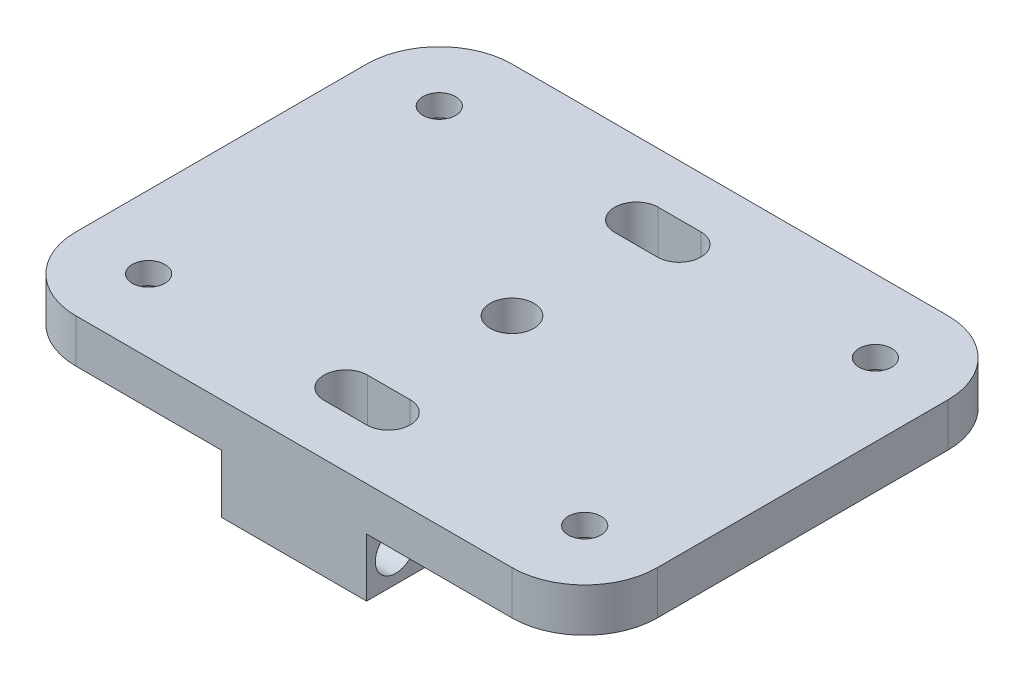
ISO-10303-21;
HEADER;
FILE_DESCRIPTION(('STEP AP214'),'2;1');
FILE_NAME('part.step','',(''),(''),'','','');
FILE_SCHEMA(('AUTOMOTIVE_DESIGN { 1 0 10303 214 1 1 1 1 }'));
ENDSEC;
DATA;
#1=APPLICATION_CONTEXT('core data for automotive mechanical design processes');
#2=APPLICATION_PROTOCOL_DEFINITION('international standard','automotive_design',2000,#1);
#3=PRODUCT_CONTEXT('',#1,'mechanical');
#4=PRODUCT('Part','Part','',(#3));
#5=PRODUCT_RELATED_PRODUCT_CATEGORY('part','',(#4));
#6=PRODUCT_DEFINITION_FORMATION('','',#4);
#7=PRODUCT_DEFINITION_CONTEXT('part definition',#1,'design');
#8=PRODUCT_DEFINITION('design','',#6,#7);
#9=PRODUCT_DEFINITION_SHAPE('','',#8);
#10=(LENGTH_UNIT() NAMED_UNIT(*) SI_UNIT(.MILLI.,.METRE.));
#11=(NAMED_UNIT(*) PLANE_ANGLE_UNIT() SI_UNIT($,.RADIAN.));
#12=(NAMED_UNIT(*) SI_UNIT($,.STERADIAN.) SOLID_ANGLE_UNIT());
#13=UNCERTAINTY_MEASURE_WITH_UNIT(LENGTH_MEASURE(1.E-05),#10,'distance_accuracy_value','');
#14=(GEOMETRIC_REPRESENTATION_CONTEXT(3) GLOBAL_UNCERTAINTY_ASSIGNED_CONTEXT((#13)) GLOBAL_UNIT_ASSIGNED_CONTEXT((#10,
#11,#12)) REPRESENTATION_CONTEXT('',''));
#15=CARTESIAN_POINT('',(0.,0.,0.));
#16=DIRECTION('',(0.,0.,1.));
#17=DIRECTION('',(1.,0.,0.));
#18=AXIS2_PLACEMENT_3D('',#15,#16,#17);
#19=CARTESIAN_POINT('',(-30.,6.,-20.));
#20=DIRECTION('',(0.,-1.,0.));
#21=DIRECTION('',(0.,0.,-1.));
#22=AXIS2_PLACEMENT_3D('',#19,#20,#21);
#23=CYLINDRICAL_SURFACE('',#22,2.25);
#24=CARTESIAN_POINT('',(-30.,6.,-20.));
#25=DIRECTION('',(0.,1.,0.));
#26=DIRECTION('',(0.,0.,1.));
#27=AXIS2_PLACEMENT_3D('',#24,#25,#26);
#28=CIRCLE('',#27,2.25);
#29=CARTESIAN_POINT('',(-30.,6.,-17.75));
#30=VERTEX_POINT('',#29);
#31=EDGE_CURVE('E332',#30,#30,#28,.T.);
#32=ORIENTED_EDGE('',*,*,#31,.T.);
#33=EDGE_LOOP('',(#32));
#34=FACE_BOUND('',#33,.T.);
#35=CARTESIAN_POINT('',(-30.,3.,-20.));
#36=DIRECTION('',(0.,-1.,0.));
#37=DIRECTION('',(0.,0.,-1.));
#38=AXIS2_PLACEMENT_3D('',#35,#36,#37);
#39=CIRCLE('',#38,2.25);
#40=CARTESIAN_POINT('',(-30.,3.,-22.25));
#41=VERTEX_POINT('',#40);
#42=EDGE_CURVE('E42',#41,#41,#39,.T.);
#43=ORIENTED_EDGE('',*,*,#42,.T.);
#44=EDGE_LOOP('',(#43));
#45=FACE_BOUND('',#44,.T.);
#46=ADVANCED_FACE('F38',(#34,#45),#23,.F.);
#47=CARTESIAN_POINT('',(30.,6.,-20.));
#48=DIRECTION('',(0.,-1.,0.));
#49=DIRECTION('',(0.,0.,-1.));
#50=AXIS2_PLACEMENT_3D('',#47,#48,#49);
#51=CYLINDRICAL_SURFACE('',#50,2.25);
#52=CARTESIAN_POINT('',(30.,6.,-20.));
#53=DIRECTION('',(0.,1.,0.));
#54=DIRECTION('',(0.,0.,1.));
#55=AXIS2_PLACEMENT_3D('',#52,#53,#54);
#56=CIRCLE('',#55,2.25);
#57=CARTESIAN_POINT('',(30.,6.,-17.75));
#58=VERTEX_POINT('',#57);
#59=EDGE_CURVE('E329',#58,#58,#56,.T.);
#60=ORIENTED_EDGE('',*,*,#59,.T.);
#61=EDGE_LOOP('',(#60));
#62=FACE_BOUND('',#61,.T.);
#63=CARTESIAN_POINT('',(30.,3.,-20.));
#64=DIRECTION('',(0.,-1.,0.));
#65=DIRECTION('',(0.,0.,-1.));
#66=AXIS2_PLACEMENT_3D('',#63,#64,#65);
#67=CIRCLE('',#66,2.25);
#68=CARTESIAN_POINT('',(30.,3.,-22.25));
#69=VERTEX_POINT('',#68);
#70=EDGE_CURVE('E402',#69,#69,#67,.T.);
#71=ORIENTED_EDGE('',*,*,#70,.T.);
#72=EDGE_LOOP('',(#71));
#73=FACE_BOUND('',#72,.T.);
#74=ADVANCED_FACE('F488',(#62,#73),#51,.F.);
#75=CARTESIAN_POINT('',(-30.,6.,20.));
#76=DIRECTION('',(0.,-1.,0.));
#77=DIRECTION('',(0.,0.,-1.));
#78=AXIS2_PLACEMENT_3D('',#75,#76,#77);
#79=CYLINDRICAL_SURFACE('',#78,2.25);
#80=CARTESIAN_POINT('',(-30.,6.,20.));
#81=DIRECTION('',(0.,1.,0.));
#82=DIRECTION('',(0.,0.,1.));
#83=AXIS2_PLACEMENT_3D('',#80,#81,#82);
#84=CIRCLE('',#83,2.25);
#85=CARTESIAN_POINT('',(-30.,6.,22.25));
#86=VERTEX_POINT('',#85);
#87=EDGE_CURVE('E326',#86,#86,#84,.T.);
#88=ORIENTED_EDGE('',*,*,#87,.T.);
#89=EDGE_LOOP('',(#88));
#90=FACE_BOUND('',#89,.T.);
#91=CARTESIAN_POINT('',(-30.,3.,20.));
#92=DIRECTION('',(0.,-1.,0.));
#93=DIRECTION('',(0.,0.,-1.));
#94=AXIS2_PLACEMENT_3D('',#91,#92,#93);
#95=CIRCLE('',#94,2.25);
#96=CARTESIAN_POINT('',(-30.,3.,17.75));
#97=VERTEX_POINT('',#96);
#98=EDGE_CURVE('E400',#97,#97,#95,.T.);
#99=ORIENTED_EDGE('',*,*,#98,.T.);
#100=EDGE_LOOP('',(#99));
#101=FACE_BOUND('',#100,.T.);
#102=ADVANCED_FACE('F494',(#90,#101),#79,.F.);
#103=CARTESIAN_POINT('',(30.,6.,20.));
#104=DIRECTION('',(0.,-1.,0.));
#105=DIRECTION('',(0.,0.,-1.));
#106=AXIS2_PLACEMENT_3D('',#103,#104,#105);
#107=CYLINDRICAL_SURFACE('',#106,2.25);
#108=CARTESIAN_POINT('',(30.,6.,20.));
#109=DIRECTION('',(0.,1.,0.));
#110=DIRECTION('',(0.,0.,1.));
#111=AXIS2_PLACEMENT_3D('',#108,#109,#110);
#112=CIRCLE('',#111,2.25);
#113=CARTESIAN_POINT('',(30.,6.,22.25));
#114=VERTEX_POINT('',#113);
#115=EDGE_CURVE('E322',#114,#114,#112,.T.);
#116=ORIENTED_EDGE('',*,*,#115,.T.);
#117=EDGE_LOOP('',(#116));
#118=FACE_BOUND('',#117,.T.);
#119=CARTESIAN_POINT('',(30.,3.,20.));
#120=DIRECTION('',(0.,-1.,0.));
#121=DIRECTION('',(0.,0.,-1.));
#122=AXIS2_PLACEMENT_3D('',#119,#120,#121);
#123=CIRCLE('',#122,2.25);
#124=CARTESIAN_POINT('',(30.,3.,17.75));
#125=VERTEX_POINT('',#124);
#126=EDGE_CURVE('E285',#125,#125,#123,.T.);
#127=ORIENTED_EDGE('',*,*,#126,.T.);
#128=EDGE_LOOP('',(#127));
#129=FACE_BOUND('',#128,.T.);
#130=ADVANCED_FACE('F428',(#118,#129),#107,.F.);
#131=CARTESIAN_POINT('',(0.,0.,0.));
#132=DIRECTION('',(0.,1.,0.));
#133=DIRECTION('',(0.,0.,1.));
#134=AXIS2_PLACEMENT_3D('',#131,#132,#133);
#135=PLANE('',#134);
#136=CARTESIAN_POINT('',(-30.,0.,-20.));
#137=DIRECTION('',(0.,-1.,0.));
#138=DIRECTION('',(0.,0.,-1.));
#139=AXIS2_PLACEMENT_3D('',#136,#137,#138);
#140=CIRCLE('',#139,4.);
#141=CARTESIAN_POINT('',(-30.,0.,-24.));
#142=VERTEX_POINT('',#141);
#143=EDGE_CURVE('E274',#142,#142,#140,.T.);
#144=ORIENTED_EDGE('',*,*,#143,.F.);
#145=EDGE_LOOP('',(#144));
#146=FACE_BOUND('',#145,.T.);
#147=CARTESIAN_POINT('',(-30.,0.,20.));
#148=DIRECTION('',(0.,-1.,0.));
#149=DIRECTION('',(0.,0.,-1.));
#150=AXIS2_PLACEMENT_3D('',#147,#148,#149);
#151=CIRCLE('',#150,4.);
#152=CARTESIAN_POINT('',(-30.,0.,16.));
#153=VERTEX_POINT('',#152);
#154=EDGE_CURVE('E273',#153,#153,#151,.T.);
#155=ORIENTED_EDGE('',*,*,#154,.F.);
#156=EDGE_LOOP('',(#155));
#157=FACE_BOUND('',#156,.T.);
#158=DIRECTION('',(0.,0.,-1.));
#159=VECTOR('',#158,1.);
#160=CARTESIAN_POINT('',(-10.,0.,30.));
#161=LINE('',#160,#159);
#162=CARTESIAN_POINT('',(-10.,0.,30.));
#163=VERTEX_POINT('',#162);
#164=CARTESIAN_POINT('',(-10.,0.,-30.));
#165=VERTEX_POINT('',#164);
#166=EDGE_CURVE('E291',#163,#165,#161,.T.);
#167=ORIENTED_EDGE('',*,*,#166,.F.);
#168=DIRECTION('',(1.,0.,0.));
#169=VECTOR('',#168,1.);
#170=CARTESIAN_POINT('',(0.,0.,30.));
#171=LINE('',#170,#169);
#172=CARTESIAN_POINT('',(-30.,0.,30.));
#173=VERTEX_POINT('',#172);
#174=EDGE_CURVE('E374',#173,#163,#171,.T.);
#175=ORIENTED_EDGE('',*,*,#174,.F.);
#176=CARTESIAN_POINT('',(-30.,0.,20.));
#177=DIRECTION('',(0.,1.,0.));
#178=DIRECTION('',(0.,0.,1.));
#179=AXIS2_PLACEMENT_3D('',#176,#177,#178);
#180=CIRCLE('',#179,10.);
#181=CARTESIAN_POINT('',(-40.,0.,20.));
#182=VERTEX_POINT('',#181);
#183=EDGE_CURVE('E370',#182,#173,#180,.T.);
#184=ORIENTED_EDGE('',*,*,#183,.F.);
#185=DIRECTION('',(0.,0.,1.));
#186=VECTOR('',#185,1.);
#187=CARTESIAN_POINT('',(-40.,0.,0.));
#188=LINE('',#187,#186);
#189=CARTESIAN_POINT('',(-40.,0.,-20.));
#190=VERTEX_POINT('',#189);
#191=EDGE_CURVE('E367',#190,#182,#188,.T.);
#192=ORIENTED_EDGE('',*,*,#191,.F.);
#193=CARTESIAN_POINT('',(-30.,0.,-20.));
#194=DIRECTION('',(0.,1.,0.));
#195=DIRECTION('',(0.,0.,1.));
#196=AXIS2_PLACEMENT_3D('',#193,#194,#195);
#197=CIRCLE('',#196,10.);
#198=CARTESIAN_POINT('',(-30.,0.,-30.));
#199=VERTEX_POINT('',#198);
#200=EDGE_CURVE('E364',#199,#190,#197,.T.);
#201=ORIENTED_EDGE('',*,*,#200,.F.);
#202=DIRECTION('',(1.,0.,0.));
#203=VECTOR('',#202,1.);
#204=CARTESIAN_POINT('',(0.,0.,-30.));
#205=LINE('',#204,#203);
#206=EDGE_CURVE('E362',#199,#165,#205,.T.);
#207=ORIENTED_EDGE('',*,*,#206,.T.);
#208=EDGE_LOOP('',(#167,#175,#184,#192,#201,#207));
#209=FACE_BOUND('',#208,.T.);
#210=ADVANCED_FACE('F424',(#146,#157,#209),#135,.F.);
#211=CARTESIAN_POINT('',(30.,0.,20.));
#212=DIRECTION('',(0.,-1.,0.));
#213=DIRECTION('',(0.,0.,-1.));
#214=AXIS2_PLACEMENT_3D('',#211,#212,#213);
#215=CIRCLE('',#214,4.00000000000001);
#216=CARTESIAN_POINT('',(30.,0.,16.));
#217=VERTEX_POINT('',#216);
#218=EDGE_CURVE('E267',#217,#217,#215,.T.);
#219=ORIENTED_EDGE('',*,*,#218,.F.);
#220=EDGE_LOOP('',(#219));
#221=FACE_BOUND('',#220,.T.);
#222=CARTESIAN_POINT('',(30.,0.,-20.));
#223=DIRECTION('',(0.,-1.,0.));
#224=DIRECTION('',(0.,0.,-1.));
#225=AXIS2_PLACEMENT_3D('',#222,#223,#224);
#226=CIRCLE('',#225,4.00000000000001);
#227=CARTESIAN_POINT('',(30.,0.,-24.));
#228=VERTEX_POINT('',#227);
#229=EDGE_CURVE('E255',#228,#228,#226,.T.);
#230=ORIENTED_EDGE('',*,*,#229,.F.);
#231=EDGE_LOOP('',(#230));
#232=FACE_BOUND('',#231,.T.);
#233=DIRECTION('',(0.,0.,1.));
#234=VECTOR('',#233,1.);
#235=CARTESIAN_POINT('',(9.99999999999999,0.,30.));
#236=LINE('',#235,#234);
#237=CARTESIAN_POINT('',(10.,0.,-30.));
#238=VERTEX_POINT('',#237);
#239=CARTESIAN_POINT('',(9.99999999999999,0.,30.));
#240=VERTEX_POINT('',#239);
#241=EDGE_CURVE('E296',#238,#240,#236,.T.);
#242=ORIENTED_EDGE('',*,*,#241,.F.);
#243=CARTESIAN_POINT('',(30.,0.,-30.));
#244=VERTEX_POINT('',#243);
#245=EDGE_CURVE('E361',#238,#244,#205,.T.);
#246=ORIENTED_EDGE('',*,*,#245,.T.);
#247=CARTESIAN_POINT('',(30.,0.,-20.));
#248=DIRECTION('',(0.,1.,0.));
#249=DIRECTION('',(0.,0.,1.));
#250=AXIS2_PLACEMENT_3D('',#247,#248,#249);
#251=CIRCLE('',#250,10.);
#252=CARTESIAN_POINT('',(40.,0.,-20.));
#253=VERTEX_POINT('',#252);
#254=EDGE_CURVE('E318',#244,#253,#251,.F.);
#255=ORIENTED_EDGE('',*,*,#254,.T.);
#256=DIRECTION('',(0.,0.,1.));
#257=VECTOR('',#256,1.);
#258=CARTESIAN_POINT('',(40.,0.,0.));
#259=LINE('',#258,#257);
#260=CARTESIAN_POINT('',(40.,0.,20.));
#261=VERTEX_POINT('',#260);
#262=EDGE_CURVE('E323',#253,#261,#259,.T.);
#263=ORIENTED_EDGE('',*,*,#262,.T.);
#264=CARTESIAN_POINT('',(30.,0.,20.));
#265=DIRECTION('',(0.,1.,0.));
#266=DIRECTION('',(0.,0.,1.));
#267=AXIS2_PLACEMENT_3D('',#264,#265,#266);
#268=CIRCLE('',#267,9.99999999999999);
#269=CARTESIAN_POINT('',(30.,0.,30.));
#270=VERTEX_POINT('',#269);
#271=EDGE_CURVE('E377',#270,#261,#268,.T.);
#272=ORIENTED_EDGE('',*,*,#271,.F.);
#273=EDGE_CURVE('E373',#240,#270,#171,.T.);
#274=ORIENTED_EDGE('',*,*,#273,.F.);
#275=EDGE_LOOP('',(#242,#246,#255,#263,#272,#274));
#276=FACE_BOUND('',#275,.T.);
#277=ADVANCED_FACE('F427',(#221,#232,#276),#135,.F.);
#278=CARTESIAN_POINT('',(30.,6.,-20.));
#279=DIRECTION('',(0.,-1.,0.));
#280=DIRECTION('',(0.,0.,-1.));
#281=AXIS2_PLACEMENT_3D('',#278,#279,#280);
#282=CYLINDRICAL_SURFACE('',#281,10.);
#283=ORIENTED_EDGE('',*,*,#254,.F.);
#284=DIRECTION('',(0.,-1.,0.));
#285=VECTOR('',#284,1.);
#286=CARTESIAN_POINT('',(30.,6.,-30.));
#287=LINE('',#286,#285);
#288=CARTESIAN_POINT('',(30.,6.,-30.));
#289=VERTEX_POINT('',#288);
#290=EDGE_CURVE('E11',#289,#244,#287,.T.);
#291=ORIENTED_EDGE('',*,*,#290,.F.);
#292=CARTESIAN_POINT('',(30.,6.,-20.));
#293=DIRECTION('',(0.,1.,0.));
#294=DIRECTION('',(0.,0.,1.));
#295=AXIS2_PLACEMENT_3D('',#292,#293,#294);
#296=CIRCLE('',#295,10.);
#297=CARTESIAN_POINT('',(40.,6.,-20.));
#298=VERTEX_POINT('',#297);
#299=EDGE_CURVE('E335',#289,#298,#296,.F.);
#300=ORIENTED_EDGE('',*,*,#299,.T.);
#301=DIRECTION('',(0.,-1.,0.));
#302=VECTOR('',#301,1.);
#303=CARTESIAN_POINT('',(40.,6.,-20.));
#304=LINE('',#303,#302);
#305=EDGE_CURVE('E358',#298,#253,#304,.T.);
#306=ORIENTED_EDGE('',*,*,#305,.T.);
#307=EDGE_LOOP('',(#283,#291,#300,#306));
#308=FACE_BOUND('',#307,.T.);
#309=ADVANCED_FACE('F461',(#308),#282,.T.);
#310=CARTESIAN_POINT('',(0.,6.,-30.));
#311=DIRECTION('',(0.,0.,-1.));
#312=DIRECTION('',(-1.,0.,0.));
#313=AXIS2_PLACEMENT_3D('',#310,#311,#312);
#314=PLANE('',#313);
#315=ORIENTED_EDGE('',*,*,#206,.F.);
#316=DIRECTION('',(0.,-1.,0.));
#317=VECTOR('',#316,1.);
#318=CARTESIAN_POINT('',(-30.,6.,-30.));
#319=LINE('',#318,#317);
#320=CARTESIAN_POINT('',(-30.,6.,-30.));
#321=VERTEX_POINT('',#320);
#322=EDGE_CURVE('E47',#321,#199,#319,.T.);
#323=ORIENTED_EDGE('',*,*,#322,.F.);
#324=DIRECTION('',(1.,0.,0.));
#325=VECTOR('',#324,1.);
#326=CARTESIAN_POINT('',(0.,6.,-30.));
#327=LINE('',#326,#325);
#328=EDGE_CURVE('E338',#321,#289,#327,.T.);
#329=ORIENTED_EDGE('',*,*,#328,.T.);
#330=ORIENTED_EDGE('',*,*,#290,.T.);
#331=ORIENTED_EDGE('',*,*,#245,.F.);
#332=DIRECTION('',(0.,1.,0.));
#333=VECTOR('',#332,1.);
#334=CARTESIAN_POINT('',(10.,-8.,-30.));
#335=LINE('',#334,#333);
#336=CARTESIAN_POINT('',(10.,-8.,-30.));
#337=VERTEX_POINT('',#336);
#338=EDGE_CURVE('E312',#337,#238,#335,.T.);
#339=ORIENTED_EDGE('',*,*,#338,.F.);
#340=DIRECTION('',(1.,0.,0.));
#341=VECTOR('',#340,1.);
#342=CARTESIAN_POINT('',(-10.,-8.,-30.));
#343=LINE('',#342,#341);
#344=CARTESIAN_POINT('',(-10.,-8.,-30.));
#345=VERTEX_POINT('',#344);
#346=EDGE_CURVE('E295',#345,#337,#343,.T.);
#347=ORIENTED_EDGE('',*,*,#346,.F.);
#348=DIRECTION('',(0.,1.,0.));
#349=VECTOR('',#348,1.);
#350=CARTESIAN_POINT('',(-10.,-8.,-30.));
#351=LINE('',#350,#349);
#352=EDGE_CURVE('E315',#345,#165,#351,.T.);
#353=ORIENTED_EDGE('',*,*,#352,.T.);
#354=EDGE_LOOP('',(#315,#323,#329,#330,#331,#339,#347,#353));
#355=FACE_BOUND('',#354,.T.);
#356=ADVANCED_FACE('F456',(#355),#314,.T.);
#357=CARTESIAN_POINT('',(-30.,6.,-20.));
#358=DIRECTION('',(0.,-1.,0.));
#359=DIRECTION('',(0.,0.,-1.));
#360=AXIS2_PLACEMENT_3D('',#357,#358,#359);
#361=CYLINDRICAL_SURFACE('',#360,10.);
#362=ORIENTED_EDGE('',*,*,#200,.T.);
#363=DIRECTION('',(0.,-1.,0.));
#364=VECTOR('',#363,1.);
#365=CARTESIAN_POINT('',(-40.,6.,-20.));
#366=LINE('',#365,#364);
#367=CARTESIAN_POINT('',(-40.,6.,-20.));
#368=VERTEX_POINT('',#367);
#369=EDGE_CURVE('E394',#368,#190,#366,.T.);
#370=ORIENTED_EDGE('',*,*,#369,.F.);
#371=CARTESIAN_POINT('',(-30.,6.,-20.));
#372=DIRECTION('',(0.,1.,0.));
#373=DIRECTION('',(0.,0.,1.));
#374=AXIS2_PLACEMENT_3D('',#371,#372,#373);
#375=CIRCLE('',#374,10.);
#376=EDGE_CURVE('E341',#321,#368,#375,.T.);
#377=ORIENTED_EDGE('',*,*,#376,.F.);
#378=ORIENTED_EDGE('',*,*,#322,.T.);
#379=EDGE_LOOP('',(#362,#370,#377,#378));
#380=FACE_BOUND('',#379,.T.);
#381=ADVANCED_FACE('F478',(#380),#361,.T.);
#382=CARTESIAN_POINT('',(-40.,6.,0.));
#383=DIRECTION('',(1.,0.,0.));
#384=DIRECTION('',(0.,0.,-1.));
#385=AXIS2_PLACEMENT_3D('',#382,#383,#384);
#386=PLANE('',#385);
#387=ORIENTED_EDGE('',*,*,#191,.T.);
#388=DIRECTION('',(0.,-1.,0.));
#389=VECTOR('',#388,1.);
#390=CARTESIAN_POINT('',(-40.,6.,20.));
#391=LINE('',#390,#389);
#392=CARTESIAN_POINT('',(-40.,6.,20.));
#393=VERTEX_POINT('',#392);
#394=EDGE_CURVE('E391',#393,#182,#391,.T.);
#395=ORIENTED_EDGE('',*,*,#394,.F.);
#396=DIRECTION('',(0.,0.,1.));
#397=VECTOR('',#396,1.);
#398=CARTESIAN_POINT('',(-40.,6.,0.));
#399=LINE('',#398,#397);
#400=EDGE_CURVE('E344',#368,#393,#399,.T.);
#401=ORIENTED_EDGE('',*,*,#400,.F.);
#402=ORIENTED_EDGE('',*,*,#369,.T.);
#403=EDGE_LOOP('',(#387,#395,#401,#402));
#404=FACE_BOUND('',#403,.T.);
#405=ADVANCED_FACE('F475',(#404),#386,.F.);
#406=CARTESIAN_POINT('',(-30.,6.,20.));
#407=DIRECTION('',(0.,-1.,0.));
#408=DIRECTION('',(0.,0.,-1.));
#409=AXIS2_PLACEMENT_3D('',#406,#407,#408);
#410=CYLINDRICAL_SURFACE('',#409,10.);
#411=ORIENTED_EDGE('',*,*,#183,.T.);
#412=DIRECTION('',(0.,-1.,0.));
#413=VECTOR('',#412,1.);
#414=CARTESIAN_POINT('',(-30.,6.,30.));
#415=LINE('',#414,#413);
#416=CARTESIAN_POINT('',(-30.,6.,30.));
#417=VERTEX_POINT('',#416);
#418=EDGE_CURVE('E388',#417,#173,#415,.T.);
#419=ORIENTED_EDGE('',*,*,#418,.F.);
#420=CARTESIAN_POINT('',(-30.,6.,20.));
#421=DIRECTION('',(0.,1.,0.));
#422=DIRECTION('',(0.,0.,1.));
#423=AXIS2_PLACEMENT_3D('',#420,#421,#422);
#424=CIRCLE('',#423,10.);
#425=EDGE_CURVE('E347',#393,#417,#424,.T.);
#426=ORIENTED_EDGE('',*,*,#425,.F.);
#427=ORIENTED_EDGE('',*,*,#394,.T.);
#428=EDGE_LOOP('',(#411,#419,#426,#427));
#429=FACE_BOUND('',#428,.T.);
#430=ADVANCED_FACE('F472',(#429),#410,.T.);
#431=CARTESIAN_POINT('',(0.,6.,30.));
#432=DIRECTION('',(0.,0.,-1.));
#433=DIRECTION('',(-1.,0.,0.));
#434=AXIS2_PLACEMENT_3D('',#431,#432,#433);
#435=PLANE('',#434);
#436=ORIENTED_EDGE('',*,*,#174,.T.);
#437=DIRECTION('',(0.,1.,0.));
#438=VECTOR('',#437,1.);
#439=CARTESIAN_POINT('',(-10.,-8.,30.));
#440=LINE('',#439,#438);
#441=CARTESIAN_POINT('',(-10.,-8.,30.));
#442=VERTEX_POINT('',#441);
#443=EDGE_CURVE('E302',#442,#163,#440,.T.);
#444=ORIENTED_EDGE('',*,*,#443,.F.);
#445=DIRECTION('',(-1.,0.,0.));
#446=VECTOR('',#445,1.);
#447=CARTESIAN_POINT('',(-10.,-8.,30.));
#448=LINE('',#447,#446);
#449=CARTESIAN_POINT('',(9.99999999999999,-8.,30.));
#450=VERTEX_POINT('',#449);
#451=EDGE_CURVE('E300',#450,#442,#448,.T.);
#452=ORIENTED_EDGE('',*,*,#451,.F.);
#453=DIRECTION('',(0.,1.,0.));
#454=VECTOR('',#453,1.);
#455=CARTESIAN_POINT('',(9.99999999999999,-8.,30.));
#456=LINE('',#455,#454);
#457=EDGE_CURVE('E309',#450,#240,#456,.T.);
#458=ORIENTED_EDGE('',*,*,#457,.T.);
#459=ORIENTED_EDGE('',*,*,#273,.T.);
#460=DIRECTION('',(0.,-1.,0.));
#461=VECTOR('',#460,1.);
#462=CARTESIAN_POINT('',(30.,6.,30.));
#463=LINE('',#462,#461);
#464=CARTESIAN_POINT('',(30.,6.,30.));
#465=VERTEX_POINT('',#464);
#466=EDGE_CURVE('E385',#465,#270,#463,.T.);
#467=ORIENTED_EDGE('',*,*,#466,.F.);
#468=DIRECTION('',(1.,0.,0.));
#469=VECTOR('',#468,1.);
#470=CARTESIAN_POINT('',(0.,6.,30.));
#471=LINE('',#470,#469);
#472=EDGE_CURVE('E350',#417,#465,#471,.T.);
#473=ORIENTED_EDGE('',*,*,#472,.F.);
#474=ORIENTED_EDGE('',*,*,#418,.T.);
#475=EDGE_LOOP('',(#436,#444,#452,#458,#459,#467,#473,#474));
#476=FACE_BOUND('',#475,.T.);
#477=ADVANCED_FACE('F438',(#476),#435,.F.);
#478=CARTESIAN_POINT('',(30.,6.,20.));
#479=DIRECTION('',(0.,-1.,0.));
#480=DIRECTION('',(0.,0.,-1.));
#481=AXIS2_PLACEMENT_3D('',#478,#479,#480);
#482=CYLINDRICAL_SURFACE('',#481,9.99999999999999);
#483=ORIENTED_EDGE('',*,*,#271,.T.);
#484=DIRECTION('',(0.,-1.,0.));
#485=VECTOR('',#484,1.);
#486=CARTESIAN_POINT('',(40.,6.,20.));
#487=LINE('',#486,#485);
#488=CARTESIAN_POINT('',(40.,6.,20.));
#489=VERTEX_POINT('',#488);
#490=EDGE_CURVE('E383',#489,#261,#487,.T.);
#491=ORIENTED_EDGE('',*,*,#490,.F.);
#492=CARTESIAN_POINT('',(30.,6.,20.));
#493=DIRECTION('',(0.,1.,0.));
#494=DIRECTION('',(0.,0.,1.));
#495=AXIS2_PLACEMENT_3D('',#492,#493,#494);
#496=CIRCLE('',#495,9.99999999999999);
#497=EDGE_CURVE('E353',#465,#489,#496,.T.);
#498=ORIENTED_EDGE('',*,*,#497,.F.);
#499=ORIENTED_EDGE('',*,*,#466,.T.);
#500=EDGE_LOOP('',(#483,#491,#498,#499));
#501=FACE_BOUND('',#500,.T.);
#502=ADVANCED_FACE('F468',(#501),#482,.T.);
#503=CARTESIAN_POINT('',(0.,6.,0.));
#504=DIRECTION('',(0.,-1.,0.));
#505=DIRECTION('',(0.,0.,-1.));
#506=AXIS2_PLACEMENT_3D('',#503,#504,#505);
#507=CYLINDRICAL_SURFACE('',#506,3.);
#508=CARTESIAN_POINT('',(0.,6.,0.));
#509=DIRECTION('',(0.,1.,0.));
#510=DIRECTION('',(0.,0.,1.));
#511=AXIS2_PLACEMENT_3D('',#508,#509,#510);
#512=CIRCLE('',#511,3.);
#513=CARTESIAN_POINT('',(0.,6.,3.));
#514=VERTEX_POINT('',#513);
#515=EDGE_CURVE('E319',#514,#514,#512,.T.);
#516=ORIENTED_EDGE('',*,*,#515,.T.);
#517=EDGE_LOOP('',(#516));
#518=FACE_BOUND('',#517,.T.);
#519=CARTESIAN_POINT('',(0.,-8.,0.));
#520=DIRECTION('',(0.,-1.,0.));
#521=DIRECTION('',(0.,0.,-1.));
#522=AXIS2_PLACEMENT_3D('',#519,#520,#521);
#523=CIRCLE('',#522,3.);
#524=CARTESIAN_POINT('',(0.,-8.,-3.));
#525=VERTEX_POINT('',#524);
#526=EDGE_CURVE('E288',#525,#525,#523,.T.);
#527=ORIENTED_EDGE('',*,*,#526,.T.);
#528=EDGE_LOOP('',(#527));
#529=FACE_BOUND('',#528,.T.);
#530=ADVANCED_FACE('F40',(#518,#529),#507,.F.);
#531=CARTESIAN_POINT('',(40.,6.,0.));
#532=DIRECTION('',(1.,0.,0.));
#533=DIRECTION('',(0.,0.,-1.));
#534=AXIS2_PLACEMENT_3D('',#531,#532,#533);
#535=PLANE('',#534);
#536=ORIENTED_EDGE('',*,*,#262,.F.);
#537=ORIENTED_EDGE('',*,*,#305,.F.);
#538=DIRECTION('',(0.,0.,1.));
#539=VECTOR('',#538,1.);
#540=CARTESIAN_POINT('',(40.,6.,0.));
#541=LINE('',#540,#539);
#542=EDGE_CURVE('E355',#298,#489,#541,.T.);
#543=ORIENTED_EDGE('',*,*,#542,.T.);
#544=ORIENTED_EDGE('',*,*,#490,.T.);
#545=EDGE_LOOP('',(#536,#537,#543,#544));
#546=FACE_BOUND('',#545,.T.);
#547=ADVANCED_FACE('F464',(#546),#535,.T.);
#548=CARTESIAN_POINT('',(0.,6.,0.));
#549=DIRECTION('',(0.,1.,0.));
#550=DIRECTION('',(0.,0.,1.));
#551=AXIS2_PLACEMENT_3D('',#548,#549,#550);
#552=PLANE('',#551);
#553=CARTESIAN_POINT('',(-2.87952613365418,6.,20.));
#554=DIRECTION('',(0.,-1.,0.));
#555=DIRECTION('',(0.,0.,-1.));
#556=AXIS2_PLACEMENT_3D('',#553,#554,#555);
#557=CIRCLE('',#556,3.);
#558=CARTESIAN_POINT('',(-2.87952613365418,6.,23.));
#559=VERTEX_POINT('',#558);
#560=CARTESIAN_POINT('',(-2.87952613365418,6.,17.));
#561=VERTEX_POINT('',#560);
#562=EDGE_CURVE('E181',#559,#561,#557,.T.);
#563=ORIENTED_EDGE('',*,*,#562,.T.);
#564=DIRECTION('',(1.,0.,0.));
#565=VECTOR('',#564,1.);
#566=CARTESIAN_POINT('',(-2.87952613365418,6.,17.));
#567=LINE('',#566,#565);
#568=CARTESIAN_POINT('',(3.00000000000001,6.,17.));
#569=VERTEX_POINT('',#568);
#570=EDGE_CURVE('E192',#561,#569,#567,.T.);
#571=ORIENTED_EDGE('',*,*,#570,.T.);
#572=CARTESIAN_POINT('',(3.00000000000001,6.,20.));
#573=DIRECTION('',(0.,-1.,0.));
#574=DIRECTION('',(0.,0.,-1.));
#575=AXIS2_PLACEMENT_3D('',#572,#573,#574);
#576=CIRCLE('',#575,3.);
#577=CARTESIAN_POINT('',(3.00000000000001,6.,23.));
#578=VERTEX_POINT('',#577);
#579=EDGE_CURVE('E55',#569,#578,#576,.T.);
#580=ORIENTED_EDGE('',*,*,#579,.T.);
#581=DIRECTION('',(-1.,0.,0.));
#582=VECTOR('',#581,1.);
#583=CARTESIAN_POINT('',(-2.87952613365418,6.,23.));
#584=LINE('',#583,#582);
#585=EDGE_CURVE('E189',#578,#559,#584,.T.);
#586=ORIENTED_EDGE('',*,*,#585,.T.);
#587=EDGE_LOOP('',(#563,#571,#580,#586));
#588=FACE_BOUND('',#587,.T.);
#589=CARTESIAN_POINT('',(-2.87952613365418,6.,-20.));
#590=DIRECTION('',(0.,-1.,0.));
#591=DIRECTION('',(0.,0.,-1.));
#592=AXIS2_PLACEMENT_3D('',#589,#590,#591);
#593=CIRCLE('',#592,3.);
#594=CARTESIAN_POINT('',(-2.87952613365418,6.,-17.));
#595=VERTEX_POINT('',#594);
#596=CARTESIAN_POINT('',(-2.87952613365418,6.,-23.));
#597=VERTEX_POINT('',#596);
#598=EDGE_CURVE('E222',#595,#597,#593,.T.);
#599=ORIENTED_EDGE('',*,*,#598,.T.);
#600=DIRECTION('',(1.,0.,0.));
#601=VECTOR('',#600,1.);
#602=CARTESIAN_POINT('',(-2.87952613365418,6.,-23.));
#603=LINE('',#602,#601);
#604=CARTESIAN_POINT('',(3.00000000000001,6.,-23.));
#605=VERTEX_POINT('',#604);
#606=EDGE_CURVE('E225',#597,#605,#603,.T.);
#607=ORIENTED_EDGE('',*,*,#606,.T.);
#608=CARTESIAN_POINT('',(3.00000000000001,6.,-20.));
#609=DIRECTION('',(0.,-1.,0.));
#610=DIRECTION('',(0.,0.,-1.));
#611=AXIS2_PLACEMENT_3D('',#608,#609,#610);
#612=CIRCLE('',#611,3.);
#613=CARTESIAN_POINT('',(3.00000000000001,6.,-17.));
#614=VERTEX_POINT('',#613);
#615=EDGE_CURVE('E63',#605,#614,#612,.T.);
#616=ORIENTED_EDGE('',*,*,#615,.T.);
#617=DIRECTION('',(-1.,0.,0.));
#618=VECTOR('',#617,1.);
#619=CARTESIAN_POINT('',(-2.87952613365418,6.,-17.));
#620=LINE('',#619,#618);
#621=EDGE_CURVE('E230',#614,#595,#620,.T.);
#622=ORIENTED_EDGE('',*,*,#621,.T.);
#623=EDGE_LOOP('',(#599,#607,#616,#622));
#624=FACE_BOUND('',#623,.T.);
#625=ORIENTED_EDGE('',*,*,#515,.F.);
#626=EDGE_LOOP('',(#625));
#627=FACE_BOUND('',#626,.T.);
#628=ORIENTED_EDGE('',*,*,#115,.F.);
#629=EDGE_LOOP('',(#628));
#630=FACE_BOUND('',#629,.T.);
#631=ORIENTED_EDGE('',*,*,#87,.F.);
#632=EDGE_LOOP('',(#631));
#633=FACE_BOUND('',#632,.T.);
#634=ORIENTED_EDGE('',*,*,#59,.F.);
#635=EDGE_LOOP('',(#634));
#636=FACE_BOUND('',#635,.T.);
#637=ORIENTED_EDGE('',*,*,#31,.F.);
#638=EDGE_LOOP('',(#637));
#639=FACE_BOUND('',#638,.T.);
#640=ORIENTED_EDGE('',*,*,#299,.F.);
#641=ORIENTED_EDGE('',*,*,#328,.F.);
#642=ORIENTED_EDGE('',*,*,#376,.T.);
#643=ORIENTED_EDGE('',*,*,#400,.T.);
#644=ORIENTED_EDGE('',*,*,#425,.T.);
#645=ORIENTED_EDGE('',*,*,#472,.T.);
#646=ORIENTED_EDGE('',*,*,#497,.T.);
#647=ORIENTED_EDGE('',*,*,#542,.F.);
#648=EDGE_LOOP('',(#640,#641,#642,#643,#644,#645,#646,#647));
#649=FACE_BOUND('',#648,.T.);
#650=ADVANCED_FACE('F196',(#588,#624,#627,#630,#633,#636,#639,#649),#552,.T.);
#651=CARTESIAN_POINT('',(0.,-8.,0.));
#652=DIRECTION('',(0.,-1.,0.));
#653=DIRECTION('',(0.,0.,-1.));
#654=AXIS2_PLACEMENT_3D('',#651,#652,#653);
#655=PLANE('',#654);
#656=CARTESIAN_POINT('',(-2.87952613365418,-8.,20.));
#657=DIRECTION('',(0.,-1.,0.));
#658=DIRECTION('',(0.,0.,-1.));
#659=AXIS2_PLACEMENT_3D('',#656,#657,#658);
#660=CIRCLE('',#659,3.);
#661=CARTESIAN_POINT('',(-2.87952613365418,-8.,23.));
#662=VERTEX_POINT('',#661);
#663=CARTESIAN_POINT('',(-2.87952613365418,-8.,17.));
#664=VERTEX_POINT('',#663);
#665=EDGE_CURVE('E184',#662,#664,#660,.T.);
#666=ORIENTED_EDGE('',*,*,#665,.F.);
#667=DIRECTION('',(-1.,0.,0.));
#668=VECTOR('',#667,1.);
#669=CARTESIAN_POINT('',(-2.87952613365418,-8.,23.));
#670=LINE('',#669,#668);
#671=CARTESIAN_POINT('',(3.00000000000001,-8.,23.));
#672=VERTEX_POINT('',#671);
#673=EDGE_CURVE('E199',#672,#662,#670,.T.);
#674=ORIENTED_EDGE('',*,*,#673,.F.);
#675=CARTESIAN_POINT('',(3.00000000000001,-8.,20.));
#676=DIRECTION('',(0.,-1.,0.));
#677=DIRECTION('',(0.,0.,-1.));
#678=AXIS2_PLACEMENT_3D('',#675,#676,#677);
#679=CIRCLE('',#678,3.);
#680=CARTESIAN_POINT('',(3.00000000000001,-8.,17.));
#681=VERTEX_POINT('',#680);
#682=EDGE_CURVE('E202',#681,#672,#679,.T.);
#683=ORIENTED_EDGE('',*,*,#682,.F.);
#684=DIRECTION('',(1.,0.,0.));
#685=VECTOR('',#684,1.);
#686=CARTESIAN_POINT('',(-2.87952613365418,-8.,17.));
#687=LINE('',#686,#685);
#688=EDGE_CURVE('E211',#664,#681,#687,.T.);
#689=ORIENTED_EDGE('',*,*,#688,.F.);
#690=EDGE_LOOP('',(#666,#674,#683,#689));
#691=FACE_BOUND('',#690,.T.);
#692=CARTESIAN_POINT('',(-2.87952613365418,-8.,-20.));
#693=DIRECTION('',(0.,-1.,0.));
#694=DIRECTION('',(0.,0.,-1.));
#695=AXIS2_PLACEMENT_3D('',#692,#693,#694);
#696=CIRCLE('',#695,3.);
#697=CARTESIAN_POINT('',(-2.87952613365418,-8.,-17.));
#698=VERTEX_POINT('',#697);
#699=CARTESIAN_POINT('',(-2.87952613365418,-8.,-23.));
#700=VERTEX_POINT('',#699);
#701=EDGE_CURVE('E234',#698,#700,#696,.T.);
#702=ORIENTED_EDGE('',*,*,#701,.F.);
#703=DIRECTION('',(-1.,0.,0.));
#704=VECTOR('',#703,1.);
#705=CARTESIAN_POINT('',(-2.87952613365418,-8.,-17.));
#706=LINE('',#705,#704);
#707=CARTESIAN_POINT('',(3.00000000000001,-8.,-17.));
#708=VERTEX_POINT('',#707);
#709=EDGE_CURVE('E226',#708,#698,#706,.T.);
#710=ORIENTED_EDGE('',*,*,#709,.F.);
#711=CARTESIAN_POINT('',(3.00000000000001,-8.,-20.));
#712=DIRECTION('',(0.,-1.,0.));
#713=DIRECTION('',(0.,0.,-1.));
#714=AXIS2_PLACEMENT_3D('',#711,#712,#713);
#715=CIRCLE('',#714,3.);
#716=CARTESIAN_POINT('',(3.00000000000001,-8.,-23.));
#717=VERTEX_POINT('',#716);
#718=EDGE_CURVE('E240',#717,#708,#715,.T.);
#719=ORIENTED_EDGE('',*,*,#718,.F.);
#720=DIRECTION('',(1.,0.,0.));
#721=VECTOR('',#720,1.);
#722=CARTESIAN_POINT('',(-2.87952613365418,-8.,-23.));
#723=LINE('',#722,#721);
#724=EDGE_CURVE('E236',#700,#717,#723,.T.);
#725=ORIENTED_EDGE('',*,*,#724,.F.);
#726=EDGE_LOOP('',(#702,#710,#719,#725));
#727=FACE_BOUND('',#726,.T.);
#728=DIRECTION('',(0.,0.,-1.));
#729=VECTOR('',#728,1.);
#730=CARTESIAN_POINT('',(-10.,-8.,30.));
#731=LINE('',#730,#729);
#732=EDGE_CURVE('E292',#442,#345,#731,.T.);
#733=ORIENTED_EDGE('',*,*,#732,.T.);
#734=ORIENTED_EDGE('',*,*,#346,.T.);
#735=DIRECTION('',(0.,0.,1.));
#736=VECTOR('',#735,1.);
#737=CARTESIAN_POINT('',(9.99999999999999,-8.,30.));
#738=LINE('',#737,#736);
#739=EDGE_CURVE('E298',#337,#450,#738,.T.);
#740=ORIENTED_EDGE('',*,*,#739,.T.);
#741=ORIENTED_EDGE('',*,*,#451,.T.);
#742=EDGE_LOOP('',(#733,#734,#740,#741));
#743=FACE_BOUND('',#742,.T.);
#744=ORIENTED_EDGE('',*,*,#526,.F.);
#745=EDGE_LOOP('',(#744));
#746=FACE_BOUND('',#745,.T.);
#747=ADVANCED_FACE('F444',(#691,#727,#743,#746),#655,.T.);
#748=CARTESIAN_POINT('',(-10.,-8.,30.));
#749=DIRECTION('',(1.,0.,0.));
#750=DIRECTION('',(0.,0.,-1.));
#751=AXIS2_PLACEMENT_3D('',#748,#749,#750);
#752=PLANE('',#751);
#753=CARTESIAN_POINT('',(-10.,-3.87740140958037,26.));
#754=DIRECTION('',(-1.,0.,0.));
#755=DIRECTION('',(0.,0.,1.));
#756=AXIS2_PLACEMENT_3D('',#753,#754,#755);
#757=CIRCLE('',#756,2.8);
#758=CARTESIAN_POINT('',(-10.,-3.87740140958037,28.8));
#759=VERTEX_POINT('',#758);
#760=EDGE_CURVE('E256',#759,#759,#757,.T.);
#761=ORIENTED_EDGE('',*,*,#760,.F.);
#762=EDGE_LOOP('',(#761));
#763=FACE_BOUND('',#762,.T.);
#764=CARTESIAN_POINT('',(-10.,-3.87740140958037,-26.));
#765=DIRECTION('',(-1.,0.,0.));
#766=DIRECTION('',(0.,0.,1.));
#767=AXIS2_PLACEMENT_3D('',#764,#765,#766);
#768=CIRCLE('',#767,2.80000000000001);
#769=CARTESIAN_POINT('',(-10.,-3.87740140958037,-23.2));
#770=VERTEX_POINT('',#769);
#771=EDGE_CURVE('E218',#770,#770,#768,.T.);
#772=ORIENTED_EDGE('',*,*,#771,.F.);
#773=EDGE_LOOP('',(#772));
#774=FACE_BOUND('',#773,.T.);
#775=ORIENTED_EDGE('',*,*,#166,.T.);
#776=ORIENTED_EDGE('',*,*,#352,.F.);
#777=ORIENTED_EDGE('',*,*,#732,.F.);
#778=ORIENTED_EDGE('',*,*,#443,.T.);
#779=EDGE_LOOP('',(#775,#776,#777,#778));
#780=FACE_BOUND('',#779,.T.);
#781=ADVANCED_FACE('F442',(#763,#774,#780),#752,.F.);
#782=CARTESIAN_POINT('',(9.99999999999999,-8.,30.));
#783=DIRECTION('',(-1.,0.,0.));
#784=DIRECTION('',(0.,0.,1.));
#785=AXIS2_PLACEMENT_3D('',#782,#783,#784);
#786=PLANE('',#785);
#787=CARTESIAN_POINT('',(10.,-3.88,26.));
#788=DIRECTION('',(1.,0.,0.));
#789=DIRECTION('',(0.,0.,-1.));
#790=AXIS2_PLACEMENT_3D('',#787,#788,#789);
#791=CIRCLE('',#790,2.8);
#792=CARTESIAN_POINT('',(10.,-3.88,23.2));
#793=VERTEX_POINT('',#792);
#794=EDGE_CURVE('E799',#793,#793,#791,.T.);
#795=ORIENTED_EDGE('',*,*,#794,.F.);
#796=EDGE_LOOP('',(#795));
#797=FACE_BOUND('',#796,.T.);
#798=CARTESIAN_POINT('',(10.,-3.88,-26.));
#799=DIRECTION('',(1.,0.,0.));
#800=DIRECTION('',(0.,0.,-1.));
#801=AXIS2_PLACEMENT_3D('',#798,#799,#800);
#802=CIRCLE('',#801,2.8);
#803=CARTESIAN_POINT('',(10.,-3.88,-28.8));
#804=VERTEX_POINT('',#803);
#805=EDGE_CURVE('E205',#804,#804,#802,.T.);
#806=ORIENTED_EDGE('',*,*,#805,.F.);
#807=EDGE_LOOP('',(#806));
#808=FACE_BOUND('',#807,.T.);
#809=ORIENTED_EDGE('',*,*,#241,.T.);
#810=ORIENTED_EDGE('',*,*,#457,.F.);
#811=ORIENTED_EDGE('',*,*,#739,.F.);
#812=ORIENTED_EDGE('',*,*,#338,.T.);
#813=EDGE_LOOP('',(#809,#810,#811,#812));
#814=FACE_BOUND('',#813,.T.);
#815=ADVANCED_FACE('F452',(#797,#808,#814),#786,.F.);
#816=CARTESIAN_POINT('',(30.,3.,20.));
#817=DIRECTION('',(0.,-1.,0.));
#818=DIRECTION('',(0.,0.,-1.));
#819=AXIS2_PLACEMENT_3D('',#816,#817,#818);
#820=CYLINDRICAL_SURFACE('',#819,4.00000000000001);
#821=CARTESIAN_POINT('',(30.,3.,20.));
#822=DIRECTION('',(0.,-1.,0.));
#823=DIRECTION('',(0.,0.,-1.));
#824=AXIS2_PLACEMENT_3D('',#821,#822,#823);
#825=CIRCLE('',#824,4.00000000000001);
#826=CARTESIAN_POINT('',(30.,3.,16.));
#827=VERTEX_POINT('',#826);
#828=EDGE_CURVE('E277',#827,#827,#825,.T.);
#829=ORIENTED_EDGE('',*,*,#828,.F.);
#830=EDGE_LOOP('',(#829));
#831=FACE_BOUND('',#830,.T.);
#832=ORIENTED_EDGE('',*,*,#218,.T.);
#833=EDGE_LOOP('',(#832));
#834=FACE_BOUND('',#833,.T.);
#835=ADVANCED_FACE('F513',(#831,#834),#820,.F.);
#836=CARTESIAN_POINT('',(30.,3.,20.));
#837=DIRECTION('',(0.,-1.,0.));
#838=DIRECTION('',(0.,0.,-1.));
#839=AXIS2_PLACEMENT_3D('',#836,#837,#838);
#840=PLANE('',#839);
#841=ORIENTED_EDGE('',*,*,#126,.F.);
#842=EDGE_LOOP('',(#841));
#843=FACE_BOUND('',#842,.T.);
#844=ORIENTED_EDGE('',*,*,#828,.T.);
#845=EDGE_LOOP('',(#844));
#846=FACE_BOUND('',#845,.T.);
#847=ADVANCED_FACE('F509',(#843,#846),#840,.T.);
#848=CARTESIAN_POINT('',(-30.,3.,20.));
#849=DIRECTION('',(0.,-1.,0.));
#850=DIRECTION('',(0.,0.,-1.));
#851=AXIS2_PLACEMENT_3D('',#848,#849,#850);
#852=CYLINDRICAL_SURFACE('',#851,4.);
#853=CARTESIAN_POINT('',(-30.,3.,20.));
#854=DIRECTION('',(0.,-1.,0.));
#855=DIRECTION('',(0.,0.,-1.));
#856=AXIS2_PLACEMENT_3D('',#853,#854,#855);
#857=CIRCLE('',#856,4.);
#858=CARTESIAN_POINT('',(-30.,3.,16.));
#859=VERTEX_POINT('',#858);
#860=EDGE_CURVE('E282',#859,#859,#857,.T.);
#861=ORIENTED_EDGE('',*,*,#860,.F.);
#862=EDGE_LOOP('',(#861));
#863=FACE_BOUND('',#862,.T.);
#864=ORIENTED_EDGE('',*,*,#154,.T.);
#865=EDGE_LOOP('',(#864));
#866=FACE_BOUND('',#865,.T.);
#867=ADVANCED_FACE('F512',(#863,#866),#852,.F.);
#868=CARTESIAN_POINT('',(-30.,3.,20.));
#869=DIRECTION('',(0.,-1.,0.));
#870=DIRECTION('',(0.,0.,-1.));
#871=AXIS2_PLACEMENT_3D('',#868,#869,#870);
#872=PLANE('',#871);
#873=ORIENTED_EDGE('',*,*,#98,.F.);
#874=EDGE_LOOP('',(#873));
#875=FACE_BOUND('',#874,.T.);
#876=ORIENTED_EDGE('',*,*,#860,.T.);
#877=EDGE_LOOP('',(#876));
#878=FACE_BOUND('',#877,.T.);
#879=ADVANCED_FACE('F528',(#875,#878),#872,.T.);
#880=CARTESIAN_POINT('',(30.,3.,-20.));
#881=DIRECTION('',(0.,-1.,0.));
#882=DIRECTION('',(0.,0.,-1.));
#883=AXIS2_PLACEMENT_3D('',#880,#881,#882);
#884=CYLINDRICAL_SURFACE('',#883,4.00000000000001);
#885=CARTESIAN_POINT('',(30.,3.,-20.));
#886=DIRECTION('',(0.,-1.,0.));
#887=DIRECTION('',(0.,0.,-1.));
#888=AXIS2_PLACEMENT_3D('',#885,#886,#887);
#889=CIRCLE('',#888,4.00000000000001);
#890=CARTESIAN_POINT('',(30.,3.,-24.));
#891=VERTEX_POINT('',#890);
#892=EDGE_CURVE('E264',#891,#891,#889,.T.);
#893=ORIENTED_EDGE('',*,*,#892,.F.);
#894=EDGE_LOOP('',(#893));
#895=FACE_BOUND('',#894,.T.);
#896=ORIENTED_EDGE('',*,*,#229,.T.);
#897=EDGE_LOOP('',(#896));
#898=FACE_BOUND('',#897,.T.);
#899=ADVANCED_FACE('F526',(#895,#898),#884,.F.);
#900=CARTESIAN_POINT('',(30.,3.,-20.));
#901=DIRECTION('',(0.,-1.,0.));
#902=DIRECTION('',(0.,0.,-1.));
#903=AXIS2_PLACEMENT_3D('',#900,#901,#902);
#904=PLANE('',#903);
#905=ORIENTED_EDGE('',*,*,#70,.F.);
#906=EDGE_LOOP('',(#905));
#907=FACE_BOUND('',#906,.T.);
#908=ORIENTED_EDGE('',*,*,#892,.T.);
#909=EDGE_LOOP('',(#908));
#910=FACE_BOUND('',#909,.T.);
#911=ADVANCED_FACE('F420',(#907,#910),#904,.T.);
#912=CARTESIAN_POINT('',(-30.,3.,-20.));
#913=DIRECTION('',(0.,-1.,0.));
#914=DIRECTION('',(0.,0.,-1.));
#915=AXIS2_PLACEMENT_3D('',#912,#913,#914);
#916=CYLINDRICAL_SURFACE('',#915,4.);
#917=CARTESIAN_POINT('',(-30.,3.,-20.));
#918=DIRECTION('',(0.,-1.,0.));
#919=DIRECTION('',(0.,0.,-1.));
#920=AXIS2_PLACEMENT_3D('',#917,#918,#919);
#921=CIRCLE('',#920,4.);
#922=CARTESIAN_POINT('',(-30.,3.,-24.));
#923=VERTEX_POINT('',#922);
#924=EDGE_CURVE('E270',#923,#923,#921,.T.);
#925=ORIENTED_EDGE('',*,*,#924,.F.);
#926=EDGE_LOOP('',(#925));
#927=FACE_BOUND('',#926,.T.);
#928=ORIENTED_EDGE('',*,*,#143,.T.);
#929=EDGE_LOOP('',(#928));
#930=FACE_BOUND('',#929,.T.);
#931=ADVANCED_FACE('F414',(#927,#930),#916,.F.);
#932=CARTESIAN_POINT('',(-30.,3.,-20.));
#933=DIRECTION('',(0.,-1.,0.));
#934=DIRECTION('',(0.,0.,-1.));
#935=AXIS2_PLACEMENT_3D('',#932,#933,#934);
#936=PLANE('',#935);
#937=ORIENTED_EDGE('',*,*,#42,.F.);
#938=EDGE_LOOP('',(#937));
#939=FACE_BOUND('',#938,.T.);
#940=ORIENTED_EDGE('',*,*,#924,.T.);
#941=EDGE_LOOP('',(#940));
#942=FACE_BOUND('',#941,.T.);
#943=ADVANCED_FACE('F410',(#939,#942),#936,.T.);
#944=CARTESIAN_POINT('',(-1.9,-3.87740140958037,-26.));
#945=DIRECTION('',(-1.,0.,0.));
#946=DIRECTION('',(0.,0.,1.));
#947=AXIS2_PLACEMENT_3D('',#944,#945,#946);
#948=CYLINDRICAL_SURFACE('',#947,2.80000000000001);
#949=CARTESIAN_POINT('',(-1.9,-3.87740140958037,-26.));
#950=DIRECTION('',(-1.,0.,0.));
#951=DIRECTION('',(0.,0.,1.));
#952=AXIS2_PLACEMENT_3D('',#949,#950,#951);
#953=CIRCLE('',#952,2.80000000000001);
#954=CARTESIAN_POINT('',(-1.9,-3.87740140958037,-23.2));
#955=VERTEX_POINT('',#954);
#956=EDGE_CURVE('E259',#955,#955,#953,.T.);
#957=ORIENTED_EDGE('',*,*,#956,.F.);
#958=EDGE_LOOP('',(#957));
#959=FACE_BOUND('',#958,.T.);
#960=ORIENTED_EDGE('',*,*,#771,.T.);
#961=EDGE_LOOP('',(#960));
#962=FACE_BOUND('',#961,.T.);
#963=ADVANCED_FACE('F413',(#959,#962),#948,.F.);
#964=CARTESIAN_POINT('',(-1.9,-3.87740140958037,-26.));
#965=DIRECTION('',(-1.,0.,0.));
#966=DIRECTION('',(0.,0.,1.));
#967=AXIS2_PLACEMENT_3D('',#964,#965,#966);
#968=PLANE('',#967);
#969=ORIENTED_EDGE('',*,*,#956,.T.);
#970=EDGE_LOOP('',(#969));
#971=FACE_BOUND('',#970,.T.);
#972=ADVANCED_FACE('F654',(#971),#968,.T.);
#973=CARTESIAN_POINT('',(-1.90000000000001,-3.87740140958037,26.));
#974=DIRECTION('',(-1.,0.,0.));
#975=DIRECTION('',(0.,0.,1.));
#976=AXIS2_PLACEMENT_3D('',#973,#974,#975);
#977=CYLINDRICAL_SURFACE('',#976,2.8);
#978=CARTESIAN_POINT('',(-1.90000000000001,-3.87740140958037,26.));
#979=DIRECTION('',(-1.,0.,0.));
#980=DIRECTION('',(0.,0.,1.));
#981=AXIS2_PLACEMENT_3D('',#978,#979,#980);
#982=CIRCLE('',#981,2.8);
#983=CARTESIAN_POINT('',(-1.90000000000001,-3.87740140958037,28.8));
#984=VERTEX_POINT('',#983);
#985=EDGE_CURVE('E252',#984,#984,#982,.T.);
#986=ORIENTED_EDGE('',*,*,#985,.F.);
#987=EDGE_LOOP('',(#986));
#988=FACE_BOUND('',#987,.T.);
#989=ORIENTED_EDGE('',*,*,#760,.T.);
#990=EDGE_LOOP('',(#989));
#991=FACE_BOUND('',#990,.T.);
#992=ADVANCED_FACE('F660',(#988,#991),#977,.F.);
#993=CARTESIAN_POINT('',(-1.90000000000001,-3.87740140958037,26.));
#994=DIRECTION('',(-1.,0.,0.));
#995=DIRECTION('',(0.,0.,1.));
#996=AXIS2_PLACEMENT_3D('',#993,#994,#995);
#997=PLANE('',#996);
#998=ORIENTED_EDGE('',*,*,#985,.T.);
#999=EDGE_LOOP('',(#998));
#1000=FACE_BOUND('',#999,.T.);
#1001=ADVANCED_FACE('F668',(#1000),#997,.T.);
#1002=CARTESIAN_POINT('',(-2.87952613365418,6.,-20.));
#1003=DIRECTION('',(0.,-1.,0.));
#1004=DIRECTION('',(0.,0.,-1.));
#1005=AXIS2_PLACEMENT_3D('',#1002,#1003,#1004);
#1006=CYLINDRICAL_SURFACE('',#1005,3.);
#1007=ORIENTED_EDGE('',*,*,#701,.T.);
#1008=DIRECTION('',(0.,-1.,0.));
#1009=VECTOR('',#1008,1.);
#1010=CARTESIAN_POINT('',(-2.87952613365418,6.,-23.));
#1011=LINE('',#1010,#1009);
#1012=EDGE_CURVE('E233',#597,#700,#1011,.T.);
#1013=ORIENTED_EDGE('',*,*,#1012,.F.);
#1014=ORIENTED_EDGE('',*,*,#598,.F.);
#1015=DIRECTION('',(0.,-1.,0.));
#1016=VECTOR('',#1015,1.);
#1017=CARTESIAN_POINT('',(-2.87952613365418,6.,-17.));
#1018=LINE('',#1017,#1016);
#1019=EDGE_CURVE('E212',#595,#698,#1018,.T.);
#1020=ORIENTED_EDGE('',*,*,#1019,.T.);
#1021=EDGE_LOOP('',(#1007,#1013,#1014,#1020));
#1022=FACE_BOUND('',#1021,.T.);
#1023=ADVANCED_FACE('F675',(#1022),#1006,.F.);
#1024=CARTESIAN_POINT('',(-2.87952613365418,6.,-17.));
#1025=DIRECTION('',(0.,0.,1.));
#1026=DIRECTION('',(1.,0.,0.));
#1027=AXIS2_PLACEMENT_3D('',#1024,#1025,#1026);
#1028=PLANE('',#1027);
#1029=ORIENTED_EDGE('',*,*,#709,.T.);
#1030=ORIENTED_EDGE('',*,*,#1019,.F.);
#1031=ORIENTED_EDGE('',*,*,#621,.F.);
#1032=DIRECTION('',(0.,-1.,0.));
#1033=VECTOR('',#1032,1.);
#1034=CARTESIAN_POINT('',(3.00000000000001,6.,-17.));
#1035=LINE('',#1034,#1033);
#1036=EDGE_CURVE('E246',#614,#708,#1035,.T.);
#1037=ORIENTED_EDGE('',*,*,#1036,.T.);
#1038=EDGE_LOOP('',(#1029,#1030,#1031,#1037));
#1039=FACE_BOUND('',#1038,.T.);
#1040=ADVANCED_FACE('F682',(#1039),#1028,.F.);
#1041=CARTESIAN_POINT('',(3.00000000000001,6.,-20.));
#1042=DIRECTION('',(0.,-1.,0.));
#1043=DIRECTION('',(0.,0.,-1.));
#1044=AXIS2_PLACEMENT_3D('',#1041,#1042,#1043);
#1045=CYLINDRICAL_SURFACE('',#1044,3.);
#1046=ORIENTED_EDGE('',*,*,#718,.T.);
#1047=ORIENTED_EDGE('',*,*,#1036,.F.);
#1048=ORIENTED_EDGE('',*,*,#615,.F.);
#1049=DIRECTION('',(0.,-1.,0.));
#1050=VECTOR('',#1049,1.);
#1051=CARTESIAN_POINT('',(3.00000000000001,6.,-23.));
#1052=LINE('',#1051,#1050);
#1053=EDGE_CURVE('E248',#605,#717,#1052,.T.);
#1054=ORIENTED_EDGE('',*,*,#1053,.T.);
#1055=EDGE_LOOP('',(#1046,#1047,#1048,#1054));
#1056=FACE_BOUND('',#1055,.T.);
#1057=ADVANCED_FACE('F690',(#1056),#1045,.F.);
#1058=CARTESIAN_POINT('',(-2.87952613365418,6.,-23.));
#1059=DIRECTION('',(0.,0.,-1.));
#1060=DIRECTION('',(-1.,0.,0.));
#1061=AXIS2_PLACEMENT_3D('',#1058,#1059,#1060);
#1062=PLANE('',#1061);
#1063=ORIENTED_EDGE('',*,*,#724,.T.);
#1064=ORIENTED_EDGE('',*,*,#1053,.F.);
#1065=ORIENTED_EDGE('',*,*,#606,.F.);
#1066=ORIENTED_EDGE('',*,*,#1012,.T.);
#1067=EDGE_LOOP('',(#1063,#1064,#1065,#1066));
#1068=FACE_BOUND('',#1067,.T.);
#1069=ADVANCED_FACE('F698',(#1068),#1062,.F.);
#1070=CARTESIAN_POINT('',(-2.87952613365418,6.,20.));
#1071=DIRECTION('',(0.,-1.,0.));
#1072=DIRECTION('',(0.,0.,-1.));
#1073=AXIS2_PLACEMENT_3D('',#1070,#1071,#1072);
#1074=CYLINDRICAL_SURFACE('',#1073,3.);
#1075=ORIENTED_EDGE('',*,*,#665,.T.);
#1076=DIRECTION('',(0.,-1.,0.));
#1077=VECTOR('',#1076,1.);
#1078=CARTESIAN_POINT('',(-2.87952613365418,6.,17.));
#1079=LINE('',#1078,#1077);
#1080=EDGE_CURVE('E177',#561,#664,#1079,.T.);
#1081=ORIENTED_EDGE('',*,*,#1080,.F.);
#1082=ORIENTED_EDGE('',*,*,#562,.F.);
#1083=DIRECTION('',(0.,-1.,0.));
#1084=VECTOR('',#1083,1.);
#1085=CARTESIAN_POINT('',(-2.87952613365418,6.,23.));
#1086=LINE('',#1085,#1084);
#1087=EDGE_CURVE('E216',#559,#662,#1086,.T.);
#1088=ORIENTED_EDGE('',*,*,#1087,.T.);
#1089=EDGE_LOOP('',(#1075,#1081,#1082,#1088));
#1090=FACE_BOUND('',#1089,.T.);
#1091=ADVANCED_FACE('F179',(#1090),#1074,.F.);
#1092=CARTESIAN_POINT('',(-2.87952613365418,6.,23.));
#1093=DIRECTION('',(0.,0.,1.));
#1094=DIRECTION('',(1.,0.,0.));
#1095=AXIS2_PLACEMENT_3D('',#1092,#1093,#1094);
#1096=PLANE('',#1095);
#1097=ORIENTED_EDGE('',*,*,#673,.T.);
#1098=ORIENTED_EDGE('',*,*,#1087,.F.);
#1099=ORIENTED_EDGE('',*,*,#585,.F.);
#1100=DIRECTION('',(0.,-1.,0.));
#1101=VECTOR('',#1100,1.);
#1102=CARTESIAN_POINT('',(3.00000000000001,6.,23.));
#1103=LINE('',#1102,#1101);
#1104=EDGE_CURVE('E219',#578,#672,#1103,.T.);
#1105=ORIENTED_EDGE('',*,*,#1104,.T.);
#1106=EDGE_LOOP('',(#1097,#1098,#1099,#1105));
#1107=FACE_BOUND('',#1106,.T.);
#1108=ADVANCED_FACE('F712',(#1107),#1096,.F.);
#1109=CARTESIAN_POINT('',(3.00000000000001,6.,20.));
#1110=DIRECTION('',(0.,-1.,0.));
#1111=DIRECTION('',(0.,0.,-1.));
#1112=AXIS2_PLACEMENT_3D('',#1109,#1110,#1111);
#1113=CYLINDRICAL_SURFACE('',#1112,3.);
#1114=ORIENTED_EDGE('',*,*,#682,.T.);
#1115=ORIENTED_EDGE('',*,*,#1104,.F.);
#1116=ORIENTED_EDGE('',*,*,#579,.F.);
#1117=DIRECTION('',(0.,-1.,0.));
#1118=VECTOR('',#1117,1.);
#1119=CARTESIAN_POINT('',(3.00000000000001,6.,17.));
#1120=LINE('',#1119,#1118);
#1121=EDGE_CURVE('E188',#569,#681,#1120,.T.);
#1122=ORIENTED_EDGE('',*,*,#1121,.T.);
#1123=EDGE_LOOP('',(#1114,#1115,#1116,#1122));
#1124=FACE_BOUND('',#1123,.T.);
#1125=ADVANCED_FACE('F719',(#1124),#1113,.F.);
#1126=CARTESIAN_POINT('',(-2.87952613365418,6.,17.));
#1127=DIRECTION('',(0.,0.,-1.));
#1128=DIRECTION('',(-1.,0.,0.));
#1129=AXIS2_PLACEMENT_3D('',#1126,#1127,#1128);
#1130=PLANE('',#1129);
#1131=ORIENTED_EDGE('',*,*,#688,.T.);
#1132=ORIENTED_EDGE('',*,*,#1121,.F.);
#1133=ORIENTED_EDGE('',*,*,#570,.F.);
#1134=ORIENTED_EDGE('',*,*,#1080,.T.);
#1135=EDGE_LOOP('',(#1131,#1132,#1133,#1134));
#1136=FACE_BOUND('',#1135,.T.);
#1137=ADVANCED_FACE('F193',(#1136),#1130,.F.);
#1138=CARTESIAN_POINT('',(1.90000000000001,-3.88,-26.));
#1139=DIRECTION('',(1.,0.,0.));
#1140=DIRECTION('',(0.,0.,-1.));
#1141=AXIS2_PLACEMENT_3D('',#1138,#1139,#1140);
#1142=CYLINDRICAL_SURFACE('',#1141,2.8);
#1143=CARTESIAN_POINT('',(1.90000000000001,-3.88,-26.));
#1144=DIRECTION('',(1.,0.,0.));
#1145=DIRECTION('',(0.,0.,-1.));
#1146=AXIS2_PLACEMENT_3D('',#1143,#1144,#1145);
#1147=CIRCLE('',#1146,2.8);
#1148=CARTESIAN_POINT('',(1.90000000000001,-3.88,-28.8));
#1149=VERTEX_POINT('',#1148);
#1150=EDGE_CURVE('E802',#1149,#1149,#1147,.T.);
#1151=ORIENTED_EDGE('',*,*,#1150,.F.);
#1152=EDGE_LOOP('',(#1151));
#1153=FACE_BOUND('',#1152,.T.);
#1154=ORIENTED_EDGE('',*,*,#805,.T.);
#1155=EDGE_LOOP('',(#1154));
#1156=FACE_BOUND('',#1155,.T.);
#1157=ADVANCED_FACE('F732',(#1153,#1156),#1142,.F.);
#1158=CARTESIAN_POINT('',(1.90000000000001,-3.88,-26.));
#1159=DIRECTION('',(1.,0.,0.));
#1160=DIRECTION('',(0.,0.,-1.));
#1161=AXIS2_PLACEMENT_3D('',#1158,#1159,#1160);
#1162=PLANE('',#1161);
#1163=ORIENTED_EDGE('',*,*,#1150,.T.);
#1164=EDGE_LOOP('',(#1163));
#1165=FACE_BOUND('',#1164,.T.);
#1166=ADVANCED_FACE('F738',(#1165),#1162,.T.);
#1167=CARTESIAN_POINT('',(1.9,-3.88,26.));
#1168=DIRECTION('',(1.,0.,0.));
#1169=DIRECTION('',(0.,0.,-1.));
#1170=AXIS2_PLACEMENT_3D('',#1167,#1168,#1169);
#1171=CYLINDRICAL_SURFACE('',#1170,2.8);
#1172=CARTESIAN_POINT('',(1.9,-3.88,26.));
#1173=DIRECTION('',(1.,0.,0.));
#1174=DIRECTION('',(0.,0.,-1.));
#1175=AXIS2_PLACEMENT_3D('',#1172,#1173,#1174);
#1176=CIRCLE('',#1175,2.8);
#1177=CARTESIAN_POINT('',(1.9,-3.88,23.2));
#1178=VERTEX_POINT('',#1177);
#1179=EDGE_CURVE('E237',#1178,#1178,#1176,.T.);
#1180=ORIENTED_EDGE('',*,*,#1179,.F.);
#1181=EDGE_LOOP('',(#1180));
#1182=FACE_BOUND('',#1181,.T.);
#1183=ORIENTED_EDGE('',*,*,#794,.T.);
#1184=EDGE_LOOP('',(#1183));
#1185=FACE_BOUND('',#1184,.T.);
#1186=ADVANCED_FACE('F746',(#1182,#1185),#1171,.F.);
#1187=CARTESIAN_POINT('',(1.9,-3.88,26.));
#1188=DIRECTION('',(1.,0.,0.));
#1189=DIRECTION('',(0.,0.,-1.));
#1190=AXIS2_PLACEMENT_3D('',#1187,#1188,#1189);
#1191=PLANE('',#1190);
#1192=ORIENTED_EDGE('',*,*,#1179,.T.);
#1193=EDGE_LOOP('',(#1192));
#1194=FACE_BOUND('',#1193,.T.);
#1195=ADVANCED_FACE('F754',(#1194),#1191,.T.);
#1196=CLOSED_SHELL('',(#46,#74,#102,#130,#210,#277,#309,#356,#381,#405,#430,#477,#502,#530,#547,
#650,#747,#781,#815,#835,#847,#867,#879,#899,#911,#931,#943,#963,#972,#992,#1001,#1023,#1040,
#1057,#1069,#1091,#1108,#1125,#1137,#1157,#1166,#1186,#1195));
#1197=MANIFOLD_SOLID_BREP('B2',#1196);
#1198=ADVANCED_BREP_SHAPE_REPRESENTATION('',(#18,#1197),#14);
#1199=SHAPE_DEFINITION_REPRESENTATION(#9,#1198);
ENDSEC;
END-ISO-10303-21;
